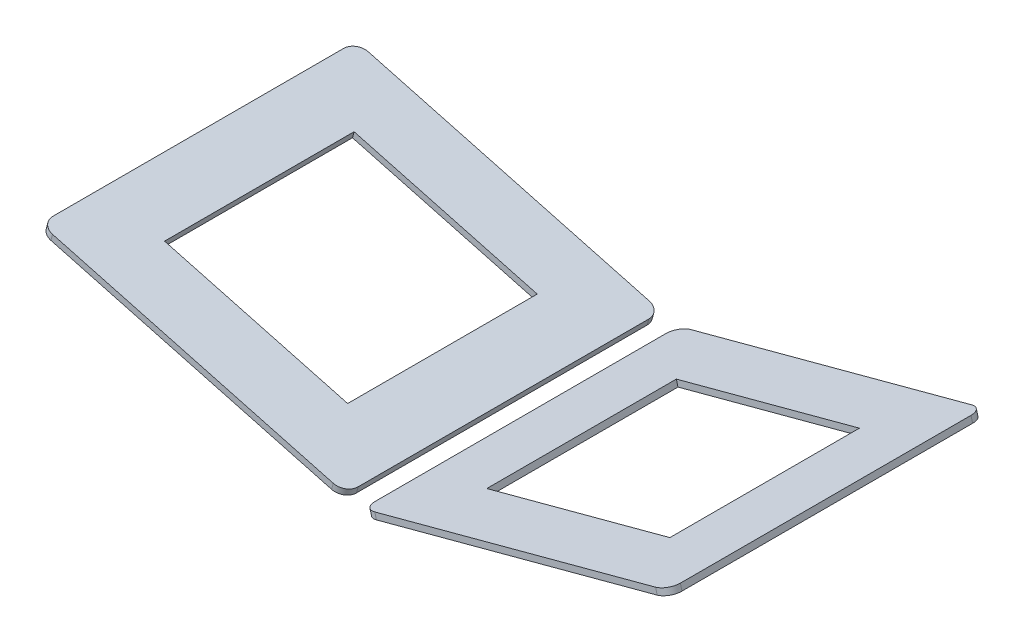
ISO-10303-21;
HEADER;
FILE_DESCRIPTION(('STEP AP214'),'2;1');
FILE_NAME('part.step','',(''),(''),'','','');
FILE_SCHEMA(('AUTOMOTIVE_DESIGN { 1 0 10303 214 1 1 1 1 }'));
ENDSEC;
DATA;
#1=APPLICATION_CONTEXT('core data for automotive mechanical design processes');
#2=APPLICATION_PROTOCOL_DEFINITION('international standard','automotive_design',2000,#1);
#3=PRODUCT_CONTEXT('',#1,'mechanical');
#4=PRODUCT('Part','Part','',(#3));
#5=PRODUCT_RELATED_PRODUCT_CATEGORY('part','',(#4));
#6=PRODUCT_DEFINITION_FORMATION('','',#4);
#7=PRODUCT_DEFINITION_CONTEXT('part definition',#1,'design');
#8=PRODUCT_DEFINITION('design','',#6,#7);
#9=PRODUCT_DEFINITION_SHAPE('','',#8);
#10=(LENGTH_UNIT() NAMED_UNIT(*) SI_UNIT(.MILLI.,.METRE.));
#11=(NAMED_UNIT(*) PLANE_ANGLE_UNIT() SI_UNIT($,.RADIAN.));
#12=(NAMED_UNIT(*) SI_UNIT($,.STERADIAN.) SOLID_ANGLE_UNIT());
#13=UNCERTAINTY_MEASURE_WITH_UNIT(LENGTH_MEASURE(1.E-05),#10,'distance_accuracy_value','');
#14=(GEOMETRIC_REPRESENTATION_CONTEXT(3) GLOBAL_UNCERTAINTY_ASSIGNED_CONTEXT((#13)) GLOBAL_UNIT_ASSIGNED_CONTEXT((#10,
#11,#12)) REPRESENTATION_CONTEXT('',''));
#15=CARTESIAN_POINT('',(0.,0.,0.));
#16=DIRECTION('',(0.,0.,1.));
#17=DIRECTION('',(1.,0.,0.));
#18=AXIS2_PLACEMENT_3D('',#15,#16,#17);
#19=CARTESIAN_POINT('',(48.0374722693509,13.9068780814151,23.3215434083601));
#20=DIRECTION('',(0.258819045102521,-0.965925826289068,0.));
#21=DIRECTION('',(0.,0.,1.));
#22=AXIS2_PLACEMENT_3D('',#19,#20,#21);
#23=PLANE('',#22);
#24=CARTESIAN_POINT('',(48.0374722693509,13.9068780814151,23.3215434083601));
#25=DIRECTION('',(-0.258819045102521,0.965925826289068,0.));
#26=DIRECTION('',(0.,0.,1.));
#27=AXIS2_PLACEMENT_3D('',#24,#25,#26);
#28=CIRCLE('',#27,2.);
#29=CARTESIAN_POINT('',(48.0374722693509,13.9068780814151,25.3215434083601));
#30=VERTEX_POINT('',#29);
#31=CARTESIAN_POINT('',(49.969323921929,14.4245161716202,23.3215434083601));
#32=VERTEX_POINT('',#31);
#33=EDGE_CURVE('E174',#30,#32,#28,.T.);
#34=ORIENTED_EDGE('',*,*,#33,.T.);
#35=DIRECTION('',(0.,0.,-1.));
#36=VECTOR('',#35,1.);
#37=CARTESIAN_POINT('',(49.969323921929,14.4245161716202,23.3215434083601));
#38=LINE('',#37,#36);
#39=CARTESIAN_POINT('',(49.969323921929,14.4245161716202,-22.6784565916399));
#40=VERTEX_POINT('',#39);
#41=EDGE_CURVE('E177',#32,#40,#38,.T.);
#42=ORIENTED_EDGE('',*,*,#41,.T.);
#43=CARTESIAN_POINT('',(48.0374722693509,13.9068780814151,-22.6784565916399));
#44=DIRECTION('',(-0.258819045102521,0.965925826289068,0.));
#45=DIRECTION('',(0.,0.,-1.));
#46=AXIS2_PLACEMENT_3D('',#43,#44,#45);
#47=CIRCLE('',#46,2.);
#48=CARTESIAN_POINT('',(48.0374722693509,13.9068780814151,-24.6784565916399));
#49=VERTEX_POINT('',#48);
#50=EDGE_CURVE('E180',#40,#49,#47,.T.);
#51=ORIENTED_EDGE('',*,*,#50,.T.);
#52=DIRECTION('',(-0.965925826289068,-0.258819045102521,0.));
#53=VECTOR('',#52,1.);
#54=CARTESIAN_POINT('',(48.0374722693509,13.9068780814151,-24.6784565916399));
#55=LINE('',#54,#53);
#56=CARTESIAN_POINT('',(3.60488426005376,2.00120200669916,-24.6784565916399));
#57=VERTEX_POINT('',#56);
#58=EDGE_CURVE('E182',#49,#57,#55,.T.);
#59=ORIENTED_EDGE('',*,*,#58,.T.);
#60=CARTESIAN_POINT('',(3.60488426005375,2.00120200669915,-22.6784565916399));
#61=DIRECTION('',(-0.258819045102521,0.965925826289068,0.));
#62=DIRECTION('',(0.,0.,-1.));
#63=AXIS2_PLACEMENT_3D('',#60,#61,#62);
#64=CIRCLE('',#63,2.);
#65=CARTESIAN_POINT('',(1.67303260747561,1.48356391649411,-22.6784565916399));
#66=VERTEX_POINT('',#65);
#67=EDGE_CURVE('E184',#57,#66,#64,.T.);
#68=ORIENTED_EDGE('',*,*,#67,.T.);
#69=DIRECTION('',(0.,0.,1.));
#70=VECTOR('',#69,1.);
#71=CARTESIAN_POINT('',(1.67303260747562,1.48356391649411,23.3215434083601));
#72=LINE('',#71,#70);
#73=CARTESIAN_POINT('',(1.67303260747562,1.48356391649411,23.3215434083601));
#74=VERTEX_POINT('',#73);
#75=EDGE_CURVE('E186',#66,#74,#72,.T.);
#76=ORIENTED_EDGE('',*,*,#75,.T.);
#77=CARTESIAN_POINT('',(3.60488426005375,2.00120200669915,23.3215434083601));
#78=DIRECTION('',(-0.258819045102521,0.965925826289068,0.));
#79=DIRECTION('',(0.,0.,1.));
#80=AXIS2_PLACEMENT_3D('',#77,#78,#79);
#81=CIRCLE('',#80,2.);
#82=CARTESIAN_POINT('',(3.60488426005377,2.00120200669916,25.3215434083601));
#83=VERTEX_POINT('',#82);
#84=EDGE_CURVE('E188',#74,#83,#81,.T.);
#85=ORIENTED_EDGE('',*,*,#84,.T.);
#86=DIRECTION('',(0.965925826289068,0.258819045102521,0.));
#87=VECTOR('',#86,1.);
#88=CARTESIAN_POINT('',(48.0374722693509,13.9068780814151,25.3215434083601));
#89=LINE('',#88,#87);
#90=EDGE_CURVE('E190',#83,#30,#89,.T.);
#91=ORIENTED_EDGE('',*,*,#90,.T.);
#92=EDGE_LOOP('',(#34,#42,#51,#59,#68,#76,#85,#91));
#93=FACE_BOUND('',#92,.T.);
#94=DIRECTION('',(0.,0.,-1.));
#95=VECTOR('',#94,1.);
#96=CARTESIAN_POINT('',(40.3100656590383,11.836325720595,15.3215434083601));
#97=LINE('',#96,#95);
#98=CARTESIAN_POINT('',(40.3100656590383,11.836325720595,15.3215434083601));
#99=VERTEX_POINT('',#98);
#100=CARTESIAN_POINT('',(40.3100656590383,11.836325720595,-14.6784565916399));
#101=VERTEX_POINT('',#100);
#102=EDGE_CURVE('E138',#99,#101,#97,.T.);
#103=ORIENTED_EDGE('',*,*,#102,.F.);
#104=DIRECTION('',(0.965925826289068,0.258819045102521,0.));
#105=VECTOR('',#104,1.);
#106=CARTESIAN_POINT('',(40.3100656590383,11.836325720595,15.3215434083601));
#107=LINE('',#106,#105);
#108=CARTESIAN_POINT('',(11.3322908703663,4.07175436751933,15.3215434083601));
#109=VERTEX_POINT('',#108);
#110=EDGE_CURVE('E160',#109,#99,#107,.T.);
#111=ORIENTED_EDGE('',*,*,#110,.F.);
#112=DIRECTION('',(0.,0.,1.));
#113=VECTOR('',#112,1.);
#114=CARTESIAN_POINT('',(11.3322908703663,4.07175436751933,15.3215434083601));
#115=LINE('',#114,#113);
#116=CARTESIAN_POINT('',(11.3322908703663,4.07175436751933,-14.6784565916399));
#117=VERTEX_POINT('',#116);
#118=EDGE_CURVE('E158',#117,#109,#115,.T.);
#119=ORIENTED_EDGE('',*,*,#118,.F.);
#120=DIRECTION('',(-0.965925826289068,-0.258819045102521,0.));
#121=VECTOR('',#120,1.);
#122=CARTESIAN_POINT('',(40.3100656590383,11.836325720595,-14.6784565916399));
#123=LINE('',#122,#121);
#124=EDGE_CURVE('E146',#101,#117,#123,.T.);
#125=ORIENTED_EDGE('',*,*,#124,.F.);
#126=EDGE_LOOP('',(#103,#111,#119,#125));
#127=FACE_BOUND('',#126,.T.);
#128=ADVANCED_FACE('F49',(#93,#127),#23,.F.);
#129=CARTESIAN_POINT('',(48.2962913144534,12.9409522551261,23.3215434083601));
#130=DIRECTION('',(0.258819045102521,-0.965925826289068,0.));
#131=DIRECTION('',(0.,0.,1.));
#132=AXIS2_PLACEMENT_3D('',#129,#130,#131);
#133=PLANE('',#132);
#134=CARTESIAN_POINT('',(48.2962913144534,12.9409522551261,23.3215434083601));
#135=DIRECTION('',(-0.258819045102521,0.965925826289068,0.));
#136=DIRECTION('',(0.,0.,1.));
#137=AXIS2_PLACEMENT_3D('',#134,#135,#136);
#138=CIRCLE('',#137,2.);
#139=CARTESIAN_POINT('',(48.2962913144534,12.9409522551261,25.3215434083601));
#140=VERTEX_POINT('',#139);
#141=CARTESIAN_POINT('',(50.2281429670316,13.4585903453311,23.3215434083601));
#142=VERTEX_POINT('',#141);
#143=EDGE_CURVE('E154',#140,#142,#138,.T.);
#144=ORIENTED_EDGE('',*,*,#143,.F.);
#145=DIRECTION('',(0.965925826289068,0.258819045102521,0.));
#146=VECTOR('',#145,1.);
#147=CARTESIAN_POINT('',(48.2962913144534,12.9409522551261,25.3215434083601));
#148=LINE('',#147,#146);
#149=CARTESIAN_POINT('',(3.86370330515629,1.03527618041009,25.3215434083601));
#150=VERTEX_POINT('',#149);
#151=EDGE_CURVE('E178',#150,#140,#148,.T.);
#152=ORIENTED_EDGE('',*,*,#151,.F.);
#153=CARTESIAN_POINT('',(3.86370330515628,1.03527618041009,23.3215434083601));
#154=DIRECTION('',(-0.258819045102521,0.965925826289068,0.));
#155=DIRECTION('',(0.,0.,1.));
#156=AXIS2_PLACEMENT_3D('',#153,#154,#155);
#157=CIRCLE('',#156,2.);
#158=CARTESIAN_POINT('',(1.93185165257814,0.517638090205043,23.3215434083601));
#159=VERTEX_POINT('',#158);
#160=EDGE_CURVE('E205',#159,#150,#157,.T.);
#161=ORIENTED_EDGE('',*,*,#160,.F.);
#162=DIRECTION('',(0.,0.,1.));
#163=VECTOR('',#162,1.);
#164=CARTESIAN_POINT('',(1.93185165257814,0.517638090205043,23.3215434083601));
#165=LINE('',#164,#163);
#166=CARTESIAN_POINT('',(1.93185165257813,0.517638090205041,-22.6784565916399));
#167=VERTEX_POINT('',#166);
#168=EDGE_CURVE('E203',#167,#159,#165,.T.);
#169=ORIENTED_EDGE('',*,*,#168,.F.);
#170=CARTESIAN_POINT('',(3.86370330515627,1.03527618041008,-22.6784565916399));
#171=DIRECTION('',(-0.258819045102521,0.965925826289068,0.));
#172=DIRECTION('',(0.,0.,-1.));
#173=AXIS2_PLACEMENT_3D('',#170,#171,#172);
#174=CIRCLE('',#173,2.);
#175=CARTESIAN_POINT('',(3.86370330515628,1.03527618041009,-24.6784565916399));
#176=VERTEX_POINT('',#175);
#177=EDGE_CURVE('E201',#176,#167,#174,.T.);
#178=ORIENTED_EDGE('',*,*,#177,.F.);
#179=DIRECTION('',(-0.965925826289068,-0.258819045102521,0.));
#180=VECTOR('',#179,1.);
#181=CARTESIAN_POINT('',(48.2962913144534,12.9409522551261,-24.6784565916399));
#182=LINE('',#181,#180);
#183=CARTESIAN_POINT('',(48.2962913144534,12.9409522551261,-24.6784565916399));
#184=VERTEX_POINT('',#183);
#185=EDGE_CURVE('E199',#184,#176,#182,.T.);
#186=ORIENTED_EDGE('',*,*,#185,.F.);
#187=CARTESIAN_POINT('',(48.2962913144534,12.9409522551261,-22.6784565916399));
#188=DIRECTION('',(-0.258819045102521,0.965925826289068,0.));
#189=DIRECTION('',(0.,0.,-1.));
#190=AXIS2_PLACEMENT_3D('',#187,#188,#189);
#191=CIRCLE('',#190,2.);
#192=CARTESIAN_POINT('',(50.2281429670315,13.4585903453311,-22.6784565916399));
#193=VERTEX_POINT('',#192);
#194=EDGE_CURVE('E197',#193,#184,#191,.T.);
#195=ORIENTED_EDGE('',*,*,#194,.F.);
#196=DIRECTION('',(0.,0.,-1.));
#197=VECTOR('',#196,1.);
#198=CARTESIAN_POINT('',(50.2281429670316,13.4585903453311,23.3215434083601));
#199=LINE('',#198,#197);
#200=EDGE_CURVE('E195',#142,#193,#199,.T.);
#201=ORIENTED_EDGE('',*,*,#200,.F.);
#202=EDGE_LOOP('',(#144,#152,#161,#169,#178,#186,#195,#201));
#203=FACE_BOUND('',#202,.T.);
#204=DIRECTION('',(0.965925826289068,0.258819045102521,0.));
#205=VECTOR('',#204,1.);
#206=CARTESIAN_POINT('',(40.5688847041409,10.8703998943059,15.3215434083601));
#207=LINE('',#206,#205);
#208=CARTESIAN_POINT('',(11.5911099154688,3.10582854123026,15.3215434083601));
#209=VERTEX_POINT('',#208);
#210=CARTESIAN_POINT('',(40.5688847041409,10.8703998943059,15.3215434083601));
#211=VERTEX_POINT('',#210);
#212=EDGE_CURVE('E147',#209,#211,#207,.T.);
#213=ORIENTED_EDGE('',*,*,#212,.T.);
#214=DIRECTION('',(0.,0.,-1.));
#215=VECTOR('',#214,1.);
#216=CARTESIAN_POINT('',(40.5688847041409,10.8703998943059,15.3215434083601));
#217=LINE('',#216,#215);
#218=CARTESIAN_POINT('',(40.5688847041409,10.8703998943059,-14.6784565916399));
#219=VERTEX_POINT('',#218);
#220=EDGE_CURVE('E72',#211,#219,#217,.T.);
#221=ORIENTED_EDGE('',*,*,#220,.T.);
#222=DIRECTION('',(-0.965925826289068,-0.258819045102521,0.));
#223=VECTOR('',#222,1.);
#224=CARTESIAN_POINT('',(40.5688847041409,10.8703998943059,-14.6784565916399));
#225=LINE('',#224,#223);
#226=CARTESIAN_POINT('',(11.5911099154688,3.10582854123026,-14.6784565916399));
#227=VERTEX_POINT('',#226);
#228=EDGE_CURVE('E153',#219,#227,#225,.T.);
#229=ORIENTED_EDGE('',*,*,#228,.T.);
#230=DIRECTION('',(0.,0.,1.));
#231=VECTOR('',#230,1.);
#232=CARTESIAN_POINT('',(11.5911099154688,3.10582854123026,15.3215434083601));
#233=LINE('',#232,#231);
#234=EDGE_CURVE('E166',#227,#209,#233,.T.);
#235=ORIENTED_EDGE('',*,*,#234,.T.);
#236=EDGE_LOOP('',(#213,#221,#229,#235));
#237=FACE_BOUND('',#236,.T.);
#238=ADVANCED_FACE('F235',(#203,#237),#133,.T.);
#239=CARTESIAN_POINT('',(48.0374722693509,13.9068780814151,23.3215434083601));
#240=DIRECTION('',(0.258819045102521,-0.965925826289068,0.));
#241=DIRECTION('',(0.,0.,1.));
#242=AXIS2_PLACEMENT_3D('',#239,#240,#241);
#243=CYLINDRICAL_SURFACE('',#242,2.);
#244=ORIENTED_EDGE('',*,*,#143,.T.);
#245=DIRECTION('',(0.258819045102521,-0.965925826289068,0.));
#246=VECTOR('',#245,1.);
#247=CARTESIAN_POINT('',(49.969323921929,14.4245161716202,23.3215434083601));
#248=LINE('',#247,#246);
#249=EDGE_CURVE('E12',#32,#142,#248,.T.);
#250=ORIENTED_EDGE('',*,*,#249,.F.);
#251=ORIENTED_EDGE('',*,*,#33,.F.);
#252=DIRECTION('',(0.258819045102521,-0.965925826289068,0.));
#253=VECTOR('',#252,1.);
#254=CARTESIAN_POINT('',(48.0374722693509,13.9068780814151,25.3215434083601));
#255=LINE('',#254,#253);
#256=EDGE_CURVE('E192',#30,#140,#255,.T.);
#257=ORIENTED_EDGE('',*,*,#256,.T.);
#258=EDGE_LOOP('',(#244,#250,#251,#257));
#259=FACE_BOUND('',#258,.T.);
#260=ADVANCED_FACE('F51',(#259),#243,.T.);
#261=CARTESIAN_POINT('',(49.969323921929,14.4245161716202,23.3215434083601));
#262=DIRECTION('',(-0.965925826289068,-0.258819045102521,0.));
#263=DIRECTION('',(0.,0.,1.));
#264=AXIS2_PLACEMENT_3D('',#261,#262,#263);
#265=PLANE('',#264);
#266=ORIENTED_EDGE('',*,*,#200,.T.);
#267=DIRECTION('',(0.258819045102521,-0.965925826289068,0.));
#268=VECTOR('',#267,1.);
#269=CARTESIAN_POINT('',(49.969323921929,14.4245161716202,-22.6784565916399));
#270=LINE('',#269,#268);
#271=EDGE_CURVE('E57',#40,#193,#270,.T.);
#272=ORIENTED_EDGE('',*,*,#271,.F.);
#273=ORIENTED_EDGE('',*,*,#41,.F.);
#274=ORIENTED_EDGE('',*,*,#249,.T.);
#275=EDGE_LOOP('',(#266,#272,#273,#274));
#276=FACE_BOUND('',#275,.T.);
#277=ADVANCED_FACE('F252',(#276),#265,.F.);
#278=CARTESIAN_POINT('',(48.0374722693509,13.9068780814151,-22.6784565916399));
#279=DIRECTION('',(0.258819045102521,-0.965925826289068,0.));
#280=DIRECTION('',(0.,0.,1.));
#281=AXIS2_PLACEMENT_3D('',#278,#279,#280);
#282=CYLINDRICAL_SURFACE('',#281,2.);
#283=ORIENTED_EDGE('',*,*,#194,.T.);
#284=DIRECTION('',(0.258819045102521,-0.965925826289068,0.));
#285=VECTOR('',#284,1.);
#286=CARTESIAN_POINT('',(48.0374722693509,13.9068780814151,-24.6784565916399));
#287=LINE('',#286,#285);
#288=EDGE_CURVE('E222',#49,#184,#287,.T.);
#289=ORIENTED_EDGE('',*,*,#288,.F.);
#290=ORIENTED_EDGE('',*,*,#50,.F.);
#291=ORIENTED_EDGE('',*,*,#271,.T.);
#292=EDGE_LOOP('',(#283,#289,#290,#291));
#293=FACE_BOUND('',#292,.T.);
#294=ADVANCED_FACE('F229',(#293),#282,.T.);
#295=CARTESIAN_POINT('',(48.0374722693509,13.9068780814151,-24.6784565916399));
#296=DIRECTION('',(0.,0.,1.));
#297=DIRECTION('',(0.965925826289068,0.258819045102521,0.));
#298=AXIS2_PLACEMENT_3D('',#295,#296,#297);
#299=PLANE('',#298);
#300=ORIENTED_EDGE('',*,*,#185,.T.);
#301=DIRECTION('',(0.258819045102521,-0.965925826289068,0.));
#302=VECTOR('',#301,1.);
#303=CARTESIAN_POINT('',(3.60488426005376,2.00120200669916,-24.6784565916399));
#304=LINE('',#303,#302);
#305=EDGE_CURVE('E219',#57,#176,#304,.T.);
#306=ORIENTED_EDGE('',*,*,#305,.F.);
#307=ORIENTED_EDGE('',*,*,#58,.F.);
#308=ORIENTED_EDGE('',*,*,#288,.T.);
#309=EDGE_LOOP('',(#300,#306,#307,#308));
#310=FACE_BOUND('',#309,.T.);
#311=ADVANCED_FACE('F241',(#310),#299,.F.);
#312=CARTESIAN_POINT('',(3.60488426005375,2.00120200669915,-22.6784565916399));
#313=DIRECTION('',(0.258819045102521,-0.965925826289068,0.));
#314=DIRECTION('',(0.,0.,1.));
#315=AXIS2_PLACEMENT_3D('',#312,#313,#314);
#316=CYLINDRICAL_SURFACE('',#315,2.);
#317=ORIENTED_EDGE('',*,*,#177,.T.);
#318=DIRECTION('',(0.258819045102521,-0.965925826289068,0.));
#319=VECTOR('',#318,1.);
#320=CARTESIAN_POINT('',(1.67303260747561,1.48356391649411,-22.6784565916399));
#321=LINE('',#320,#319);
#322=EDGE_CURVE('E216',#66,#167,#321,.T.);
#323=ORIENTED_EDGE('',*,*,#322,.F.);
#324=ORIENTED_EDGE('',*,*,#67,.F.);
#325=ORIENTED_EDGE('',*,*,#305,.T.);
#326=EDGE_LOOP('',(#317,#323,#324,#325));
#327=FACE_BOUND('',#326,.T.);
#328=ADVANCED_FACE('F245',(#327),#316,.T.);
#329=CARTESIAN_POINT('',(1.67303260747562,1.48356391649411,23.3215434083601));
#330=DIRECTION('',(0.965925826289068,0.258819045102521,0.));
#331=DIRECTION('',(0.,0.,-1.));
#332=AXIS2_PLACEMENT_3D('',#329,#330,#331);
#333=PLANE('',#332);
#334=ORIENTED_EDGE('',*,*,#168,.T.);
#335=DIRECTION('',(0.258819045102521,-0.965925826289068,0.));
#336=VECTOR('',#335,1.);
#337=CARTESIAN_POINT('',(1.67303260747562,1.48356391649411,23.3215434083601));
#338=LINE('',#337,#336);
#339=EDGE_CURVE('E213',#74,#159,#338,.T.);
#340=ORIENTED_EDGE('',*,*,#339,.F.);
#341=ORIENTED_EDGE('',*,*,#75,.F.);
#342=ORIENTED_EDGE('',*,*,#322,.T.);
#343=EDGE_LOOP('',(#334,#340,#341,#342));
#344=FACE_BOUND('',#343,.T.);
#345=ADVANCED_FACE('F265',(#344),#333,.F.);
#346=CARTESIAN_POINT('',(3.60488426005375,2.00120200669915,23.3215434083601));
#347=DIRECTION('',(0.258819045102521,-0.965925826289068,0.));
#348=DIRECTION('',(0.,0.,1.));
#349=AXIS2_PLACEMENT_3D('',#346,#347,#348);
#350=CYLINDRICAL_SURFACE('',#349,2.);
#351=ORIENTED_EDGE('',*,*,#160,.T.);
#352=DIRECTION('',(0.258819045102521,-0.965925826289068,0.));
#353=VECTOR('',#352,1.);
#354=CARTESIAN_POINT('',(3.60488426005377,2.00120200669916,25.3215434083601));
#355=LINE('',#354,#353);
#356=EDGE_CURVE('E210',#83,#150,#355,.T.);
#357=ORIENTED_EDGE('',*,*,#356,.F.);
#358=ORIENTED_EDGE('',*,*,#84,.F.);
#359=ORIENTED_EDGE('',*,*,#339,.T.);
#360=EDGE_LOOP('',(#351,#357,#358,#359));
#361=FACE_BOUND('',#360,.T.);
#362=ADVANCED_FACE('F263',(#361),#350,.T.);
#363=CARTESIAN_POINT('',(48.0374722693509,13.9068780814151,25.3215434083601));
#364=DIRECTION('',(0.,0.,-1.));
#365=DIRECTION('',(-0.965925826289068,-0.258819045102521,0.));
#366=AXIS2_PLACEMENT_3D('',#363,#364,#365);
#367=PLANE('',#366);
#368=ORIENTED_EDGE('',*,*,#151,.T.);
#369=ORIENTED_EDGE('',*,*,#256,.F.);
#370=ORIENTED_EDGE('',*,*,#90,.F.);
#371=ORIENTED_EDGE('',*,*,#356,.T.);
#372=EDGE_LOOP('',(#368,#369,#370,#371));
#373=FACE_BOUND('',#372,.T.);
#374=ADVANCED_FACE('F258',(#373),#367,.F.);
#375=CARTESIAN_POINT('',(40.3100656590383,11.836325720595,15.3215434083601));
#376=DIRECTION('',(-0.965925826289068,-0.258819045102521,0.));
#377=DIRECTION('',(0.,0.,1.));
#378=AXIS2_PLACEMENT_3D('',#375,#376,#377);
#379=PLANE('',#378);
#380=ORIENTED_EDGE('',*,*,#220,.F.);
#381=DIRECTION('',(0.258819045102521,-0.965925826289068,0.));
#382=VECTOR('',#381,1.);
#383=CARTESIAN_POINT('',(40.3100656590383,11.836325720595,15.3215434083601));
#384=LINE('',#383,#382);
#385=EDGE_CURVE('E142',#99,#211,#384,.T.);
#386=ORIENTED_EDGE('',*,*,#385,.F.);
#387=ORIENTED_EDGE('',*,*,#102,.T.);
#388=DIRECTION('',(0.258819045102521,-0.965925826289068,0.));
#389=VECTOR('',#388,1.);
#390=CARTESIAN_POINT('',(40.3100656590383,11.836325720595,-14.6784565916399));
#391=LINE('',#390,#389);
#392=EDGE_CURVE('E141',#101,#219,#391,.T.);
#393=ORIENTED_EDGE('',*,*,#392,.T.);
#394=EDGE_LOOP('',(#380,#386,#387,#393));
#395=FACE_BOUND('',#394,.T.);
#396=ADVANCED_FACE('F140',(#395),#379,.T.);
#397=CARTESIAN_POINT('',(40.3100656590383,11.836325720595,-14.6784565916399));
#398=DIRECTION('',(0.,0.,1.));
#399=DIRECTION('',(0.965925826289068,0.258819045102521,0.));
#400=AXIS2_PLACEMENT_3D('',#397,#398,#399);
#401=PLANE('',#400);
#402=ORIENTED_EDGE('',*,*,#228,.F.);
#403=ORIENTED_EDGE('',*,*,#392,.F.);
#404=ORIENTED_EDGE('',*,*,#124,.T.);
#405=DIRECTION('',(0.258819045102521,-0.965925826289068,0.));
#406=VECTOR('',#405,1.);
#407=CARTESIAN_POINT('',(11.3322908703663,4.07175436751933,-14.6784565916399));
#408=LINE('',#407,#406);
#409=EDGE_CURVE('E155',#117,#227,#408,.T.);
#410=ORIENTED_EDGE('',*,*,#409,.T.);
#411=EDGE_LOOP('',(#402,#403,#404,#410));
#412=FACE_BOUND('',#411,.T.);
#413=ADVANCED_FACE('F150',(#412),#401,.T.);
#414=CARTESIAN_POINT('',(11.3322908703663,4.07175436751933,15.3215434083601));
#415=DIRECTION('',(0.965925826289068,0.258819045102521,0.));
#416=DIRECTION('',(0.,0.,-1.));
#417=AXIS2_PLACEMENT_3D('',#414,#415,#416);
#418=PLANE('',#417);
#419=ORIENTED_EDGE('',*,*,#234,.F.);
#420=ORIENTED_EDGE('',*,*,#409,.F.);
#421=ORIENTED_EDGE('',*,*,#118,.T.);
#422=DIRECTION('',(0.258819045102521,-0.965925826289068,0.));
#423=VECTOR('',#422,1.);
#424=CARTESIAN_POINT('',(11.3322908703663,4.07175436751933,15.3215434083601));
#425=LINE('',#424,#423);
#426=EDGE_CURVE('E64',#109,#209,#425,.T.);
#427=ORIENTED_EDGE('',*,*,#426,.T.);
#428=EDGE_LOOP('',(#419,#420,#421,#427));
#429=FACE_BOUND('',#428,.T.);
#430=ADVANCED_FACE('F290',(#429),#418,.T.);
#431=CARTESIAN_POINT('',(40.3100656590383,11.836325720595,15.3215434083601));
#432=DIRECTION('',(0.,0.,-1.));
#433=DIRECTION('',(-0.965925826289068,-0.258819045102521,0.));
#434=AXIS2_PLACEMENT_3D('',#431,#432,#433);
#435=PLANE('',#434);
#436=ORIENTED_EDGE('',*,*,#212,.F.);
#437=ORIENTED_EDGE('',*,*,#426,.F.);
#438=ORIENTED_EDGE('',*,*,#110,.T.);
#439=ORIENTED_EDGE('',*,*,#385,.T.);
#440=EDGE_LOOP('',(#436,#437,#438,#439));
#441=FACE_BOUND('',#440,.T.);
#442=ADVANCED_FACE('F294',(#441),#435,.T.);
#443=CLOSED_SHELL('',(#128,#238,#260,#277,#294,#311,#328,#345,#362,#374,#396,#413,#430,#442));
#444=MANIFOLD_SOLID_BREP('B2',#443);
#445=CARTESIAN_POINT('',(0.,0.,0.));
#446=DIRECTION('',(0.,0.,1.));
#447=DIRECTION('',(1.,0.,0.));
#448=AXIS2_PLACEMENT_3D('',#445,#446,#447);
#449=PLANE('',#448);
#450=DIRECTION('',(0.25881904510252,-0.965925826289069,0.));
#451=VECTOR('',#450,1.);
#452=CARTESIAN_POINT('',(50.2281429670315,13.4585903453311,0.));
#453=LINE('',#452,#451);
#454=CARTESIAN_POINT('',(49.969323921929,14.4245161716202,0.));
#455=VERTEX_POINT('',#454);
#456=CARTESIAN_POINT('',(50.2281429670315,13.4585903453311,0.));
#457=VERTEX_POINT('',#456);
#458=EDGE_CURVE('E402',#455,#457,#453,.T.);
#459=ORIENTED_EDGE('',*,*,#458,.T.);
#460=DIRECTION('',(-0.965925826289068,-0.258819045102521,0.));
#461=VECTOR('',#460,1.);
#462=CARTESIAN_POINT('',(40.5688847041409,10.8703998943059,0.));
#463=LINE('',#462,#461);
#464=CARTESIAN_POINT('',(40.5688847041409,10.8703998943059,0.));
#465=VERTEX_POINT('',#464);
#466=EDGE_CURVE('E413',#457,#465,#463,.T.);
#467=ORIENTED_EDGE('',*,*,#466,.T.);
#468=DIRECTION('',(-0.25881904510252,0.965925826289069,0.));
#469=VECTOR('',#468,1.);
#470=CARTESIAN_POINT('',(40.3100656590383,11.836325720595,0.));
#471=LINE('',#470,#469);
#472=CARTESIAN_POINT('',(40.3100656590383,11.836325720595,0.));
#473=VERTEX_POINT('',#472);
#474=EDGE_CURVE('E398',#465,#473,#471,.T.);
#475=ORIENTED_EDGE('',*,*,#474,.T.);
#476=DIRECTION('',(0.965925826289068,0.258819045102521,0.));
#477=VECTOR('',#476,1.);
#478=CARTESIAN_POINT('',(49.969323921929,14.4245161716202,0.));
#479=LINE('',#478,#477);
#480=EDGE_CURVE('E47',#473,#455,#479,.T.);
#481=ORIENTED_EDGE('',*,*,#480,.T.);
#482=EDGE_LOOP('',(#459,#467,#475,#481));
#483=FACE_BOUND('',#482,.T.);
#484=ADVANCED_FACE('F393',(#483),#449,.F.);
#485=OPEN_SHELL('',(#484));
#486=SHELL_BASED_SURFACE_MODEL('B6',(#485));
#487=CARTESIAN_POINT('',(0.,0.,0.));
#488=DIRECTION('',(0.,0.,-1.));
#489=DIRECTION('',(-1.,0.,0.));
#490=AXIS2_PLACEMENT_3D('',#487,#488,#489);
#491=PLANE('',#490);
#492=DIRECTION('',(-0.25881904510252,-0.965925826289069,0.));
#493=VECTOR('',#492,1.);
#494=CARTESIAN_POINT('',(-50.2281429670315,13.4585903453311,0.));
#495=LINE('',#494,#493);
#496=CARTESIAN_POINT('',(-49.969323921929,14.4245161716202,0.));
#497=VERTEX_POINT('',#496);
#498=CARTESIAN_POINT('',(-50.2281429670315,13.4585903453311,0.));
#499=VERTEX_POINT('',#498);
#500=EDGE_CURVE('E456',#497,#499,#495,.T.);
#501=ORIENTED_EDGE('',*,*,#500,.T.);
#502=DIRECTION('',(0.965925826289068,-0.258819045102521,0.));
#503=VECTOR('',#502,1.);
#504=CARTESIAN_POINT('',(-40.5688847041409,10.8703998943059,0.));
#505=LINE('',#504,#503);
#506=CARTESIAN_POINT('',(-40.5688847041409,10.8703998943059,0.));
#507=VERTEX_POINT('',#506);
#508=EDGE_CURVE('E467',#499,#507,#505,.T.);
#509=ORIENTED_EDGE('',*,*,#508,.T.);
#510=DIRECTION('',(0.25881904510252,0.965925826289069,0.));
#511=VECTOR('',#510,1.);
#512=CARTESIAN_POINT('',(-40.3100656590383,11.836325720595,0.));
#513=LINE('',#512,#511);
#514=CARTESIAN_POINT('',(-40.3100656590383,11.836325720595,0.));
#515=VERTEX_POINT('',#514);
#516=EDGE_CURVE('E452',#507,#515,#513,.T.);
#517=ORIENTED_EDGE('',*,*,#516,.T.);
#518=DIRECTION('',(-0.965925826289068,0.258819045102521,0.));
#519=VECTOR('',#518,1.);
#520=CARTESIAN_POINT('',(-49.969323921929,14.4245161716202,0.));
#521=LINE('',#520,#519);
#522=EDGE_CURVE('E391',#515,#497,#521,.T.);
#523=ORIENTED_EDGE('',*,*,#522,.T.);
#524=EDGE_LOOP('',(#501,#509,#517,#523));
#525=FACE_BOUND('',#524,.T.);
#526=ADVANCED_FACE('F447',(#525),#491,.F.);
#527=OPEN_SHELL('',(#526));
#528=SHELL_BASED_SURFACE_MODEL('B41',(#527));
#529=CARTESIAN_POINT('',(-48.0374722693509,13.9068780814151,-23.3215434083601));
#530=DIRECTION('',(-0.258819045102521,-0.965925826289068,0.));
#531=DIRECTION('',(0.,0.,-1.));
#532=AXIS2_PLACEMENT_3D('',#529,#530,#531);
#533=PLANE('',#532);
#534=CARTESIAN_POINT('',(-48.0374722693509,13.9068780814151,-23.3215434083601));
#535=DIRECTION('',(0.258819045102521,0.965925826289068,0.));
#536=DIRECTION('',(0.,0.,-1.));
#537=AXIS2_PLACEMENT_3D('',#534,#535,#536);
#538=CIRCLE('',#537,2.);
#539=CARTESIAN_POINT('',(-48.0374722693509,13.9068780814151,-25.3215434083601));
#540=VERTEX_POINT('',#539);
#541=CARTESIAN_POINT('',(-49.969323921929,14.4245161716202,-23.3215434083601));
#542=VERTEX_POINT('',#541);
#543=EDGE_CURVE('E615',#540,#542,#538,.T.);
#544=ORIENTED_EDGE('',*,*,#543,.T.);
#545=DIRECTION('',(0.,0.,1.));
#546=VECTOR('',#545,1.);
#547=CARTESIAN_POINT('',(-49.969323921929,14.4245161716202,-23.3215434083601));
#548=LINE('',#547,#546);
#549=CARTESIAN_POINT('',(-49.969323921929,14.4245161716202,22.6784565916399));
#550=VERTEX_POINT('',#549);
#551=EDGE_CURVE('E618',#542,#550,#548,.T.);
#552=ORIENTED_EDGE('',*,*,#551,.T.);
#553=CARTESIAN_POINT('',(-48.0374722693509,13.9068780814151,22.6784565916399));
#554=DIRECTION('',(0.258819045102521,0.965925826289068,0.));
#555=DIRECTION('',(0.,0.,1.));
#556=AXIS2_PLACEMENT_3D('',#553,#554,#555);
#557=CIRCLE('',#556,2.);
#558=CARTESIAN_POINT('',(-48.0374722693509,13.9068780814151,24.6784565916399));
#559=VERTEX_POINT('',#558);
#560=EDGE_CURVE('E621',#550,#559,#557,.T.);
#561=ORIENTED_EDGE('',*,*,#560,.T.);
#562=DIRECTION('',(0.965925826289068,-0.258819045102521,0.));
#563=VECTOR('',#562,1.);
#564=CARTESIAN_POINT('',(-48.0374722693509,13.9068780814151,24.6784565916399));
#565=LINE('',#564,#563);
#566=CARTESIAN_POINT('',(-3.60488426005376,2.00120200669916,24.6784565916399));
#567=VERTEX_POINT('',#566);
#568=EDGE_CURVE('E623',#559,#567,#565,.T.);
#569=ORIENTED_EDGE('',*,*,#568,.T.);
#570=CARTESIAN_POINT('',(-3.60488426005375,2.00120200669915,22.6784565916399));
#571=DIRECTION('',(0.258819045102521,0.965925826289068,0.));
#572=DIRECTION('',(0.,0.,1.));
#573=AXIS2_PLACEMENT_3D('',#570,#571,#572);
#574=CIRCLE('',#573,2.);
#575=CARTESIAN_POINT('',(-1.67303260747561,1.48356391649411,22.6784565916399));
#576=VERTEX_POINT('',#575);
#577=EDGE_CURVE('E625',#567,#576,#574,.T.);
#578=ORIENTED_EDGE('',*,*,#577,.T.);
#579=DIRECTION('',(0.,0.,-1.));
#580=VECTOR('',#579,1.);
#581=CARTESIAN_POINT('',(-1.67303260747562,1.48356391649411,-23.3215434083601));
#582=LINE('',#581,#580);
#583=CARTESIAN_POINT('',(-1.67303260747562,1.48356391649411,-23.3215434083601));
#584=VERTEX_POINT('',#583);
#585=EDGE_CURVE('E627',#576,#584,#582,.T.);
#586=ORIENTED_EDGE('',*,*,#585,.T.);
#587=CARTESIAN_POINT('',(-3.60488426005375,2.00120200669915,-23.3215434083601));
#588=DIRECTION('',(0.258819045102521,0.965925826289068,0.));
#589=DIRECTION('',(0.,0.,-1.));
#590=AXIS2_PLACEMENT_3D('',#587,#588,#589);
#591=CIRCLE('',#590,2.);
#592=CARTESIAN_POINT('',(-3.60488426005377,2.00120200669916,-25.3215434083601));
#593=VERTEX_POINT('',#592);
#594=EDGE_CURVE('E629',#584,#593,#591,.T.);
#595=ORIENTED_EDGE('',*,*,#594,.T.);
#596=DIRECTION('',(-0.965925826289068,0.258819045102521,0.));
#597=VECTOR('',#596,1.);
#598=CARTESIAN_POINT('',(-48.0374722693509,13.9068780814151,-25.3215434083601));
#599=LINE('',#598,#597);
#600=EDGE_CURVE('E631',#593,#540,#599,.T.);
#601=ORIENTED_EDGE('',*,*,#600,.T.);
#602=EDGE_LOOP('',(#544,#552,#561,#569,#578,#586,#595,#601));
#603=FACE_BOUND('',#602,.T.);
#604=DIRECTION('',(0.,0.,1.));
#605=VECTOR('',#604,1.);
#606=CARTESIAN_POINT('',(-40.3100656590383,11.836325720595,-15.3215434083601));
#607=LINE('',#606,#605);
#608=CARTESIAN_POINT('',(-40.3100656590383,11.836325720595,-15.3215434083601));
#609=VERTEX_POINT('',#608);
#610=CARTESIAN_POINT('',(-40.3100656590383,11.836325720595,14.6784565916399));
#611=VERTEX_POINT('',#610);
#612=EDGE_CURVE('E579',#609,#611,#607,.T.);
#613=ORIENTED_EDGE('',*,*,#612,.F.);
#614=DIRECTION('',(-0.965925826289068,0.258819045102521,0.));
#615=VECTOR('',#614,1.);
#616=CARTESIAN_POINT('',(-40.3100656590383,11.836325720595,-15.3215434083601));
#617=LINE('',#616,#615);
#618=CARTESIAN_POINT('',(-11.3322908703663,4.07175436751933,-15.3215434083601));
#619=VERTEX_POINT('',#618);
#620=EDGE_CURVE('E601',#619,#609,#617,.T.);
#621=ORIENTED_EDGE('',*,*,#620,.F.);
#622=DIRECTION('',(0.,0.,-1.));
#623=VECTOR('',#622,1.);
#624=CARTESIAN_POINT('',(-11.3322908703663,4.07175436751933,-15.3215434083601));
#625=LINE('',#624,#623);
#626=CARTESIAN_POINT('',(-11.3322908703663,4.07175436751933,14.6784565916399));
#627=VERTEX_POINT('',#626);
#628=EDGE_CURVE('E599',#627,#619,#625,.T.);
#629=ORIENTED_EDGE('',*,*,#628,.F.);
#630=DIRECTION('',(0.965925826289068,-0.258819045102521,0.));
#631=VECTOR('',#630,1.);
#632=CARTESIAN_POINT('',(-40.3100656590383,11.836325720595,14.6784565916399));
#633=LINE('',#632,#631);
#634=EDGE_CURVE('E587',#611,#627,#633,.T.);
#635=ORIENTED_EDGE('',*,*,#634,.F.);
#636=EDGE_LOOP('',(#613,#621,#629,#635));
#637=FACE_BOUND('',#636,.T.);
#638=ADVANCED_FACE('F490',(#603,#637),#533,.F.);
#639=CARTESIAN_POINT('',(-48.2962913144534,12.9409522551261,-23.3215434083601));
#640=DIRECTION('',(-0.258819045102521,-0.965925826289068,0.));
#641=DIRECTION('',(0.,0.,-1.));
#642=AXIS2_PLACEMENT_3D('',#639,#640,#641);
#643=PLANE('',#642);
#644=CARTESIAN_POINT('',(-48.2962913144534,12.9409522551261,-23.3215434083601));
#645=DIRECTION('',(0.258819045102521,0.965925826289068,0.));
#646=DIRECTION('',(0.,0.,-1.));
#647=AXIS2_PLACEMENT_3D('',#644,#645,#646);
#648=CIRCLE('',#647,2.);
#649=CARTESIAN_POINT('',(-48.2962913144534,12.9409522551261,-25.3215434083601));
#650=VERTEX_POINT('',#649);
#651=CARTESIAN_POINT('',(-50.2281429670316,13.4585903453311,-23.3215434083601));
#652=VERTEX_POINT('',#651);
#653=EDGE_CURVE('E595',#650,#652,#648,.T.);
#654=ORIENTED_EDGE('',*,*,#653,.F.);
#655=DIRECTION('',(-0.965925826289068,0.258819045102521,0.));
#656=VECTOR('',#655,1.);
#657=CARTESIAN_POINT('',(-48.2962913144534,12.9409522551261,-25.3215434083601));
#658=LINE('',#657,#656);
#659=CARTESIAN_POINT('',(-3.86370330515629,1.03527618041009,-25.3215434083601));
#660=VERTEX_POINT('',#659);
#661=EDGE_CURVE('E619',#660,#650,#658,.T.);
#662=ORIENTED_EDGE('',*,*,#661,.F.);
#663=CARTESIAN_POINT('',(-3.86370330515628,1.03527618041009,-23.3215434083601));
#664=DIRECTION('',(0.258819045102521,0.965925826289068,0.));
#665=DIRECTION('',(0.,0.,-1.));
#666=AXIS2_PLACEMENT_3D('',#663,#664,#665);
#667=CIRCLE('',#666,2.);
#668=CARTESIAN_POINT('',(-1.93185165257814,0.517638090205043,-23.3215434083601));
#669=VERTEX_POINT('',#668);
#670=EDGE_CURVE('E646',#669,#660,#667,.T.);
#671=ORIENTED_EDGE('',*,*,#670,.F.);
#672=DIRECTION('',(0.,0.,-1.));
#673=VECTOR('',#672,1.);
#674=CARTESIAN_POINT('',(-1.93185165257814,0.517638090205043,-23.3215434083601));
#675=LINE('',#674,#673);
#676=CARTESIAN_POINT('',(-1.93185165257813,0.517638090205041,22.6784565916399));
#677=VERTEX_POINT('',#676);
#678=EDGE_CURVE('E644',#677,#669,#675,.T.);
#679=ORIENTED_EDGE('',*,*,#678,.F.);
#680=CARTESIAN_POINT('',(-3.86370330515627,1.03527618041008,22.6784565916399));
#681=DIRECTION('',(0.258819045102521,0.965925826289068,0.));
#682=DIRECTION('',(0.,0.,1.));
#683=AXIS2_PLACEMENT_3D('',#680,#681,#682);
#684=CIRCLE('',#683,2.);
#685=CARTESIAN_POINT('',(-3.86370330515628,1.03527618041009,24.6784565916399));
#686=VERTEX_POINT('',#685);
#687=EDGE_CURVE('E642',#686,#677,#684,.T.);
#688=ORIENTED_EDGE('',*,*,#687,.F.);
#689=DIRECTION('',(0.965925826289068,-0.258819045102521,0.));
#690=VECTOR('',#689,1.);
#691=CARTESIAN_POINT('',(-48.2962913144534,12.9409522551261,24.6784565916399));
#692=LINE('',#691,#690);
#693=CARTESIAN_POINT('',(-48.2962913144534,12.9409522551261,24.6784565916399));
#694=VERTEX_POINT('',#693);
#695=EDGE_CURVE('E640',#694,#686,#692,.T.);
#696=ORIENTED_EDGE('',*,*,#695,.F.);
#697=CARTESIAN_POINT('',(-48.2962913144534,12.9409522551261,22.6784565916399));
#698=DIRECTION('',(0.258819045102521,0.965925826289068,0.));
#699=DIRECTION('',(0.,0.,1.));
#700=AXIS2_PLACEMENT_3D('',#697,#698,#699);
#701=CIRCLE('',#700,2.);
#702=CARTESIAN_POINT('',(-50.2281429670315,13.4585903453311,22.6784565916399));
#703=VERTEX_POINT('',#702);
#704=EDGE_CURVE('E638',#703,#694,#701,.T.);
#705=ORIENTED_EDGE('',*,*,#704,.F.);
#706=DIRECTION('',(0.,0.,1.));
#707=VECTOR('',#706,1.);
#708=CARTESIAN_POINT('',(-50.2281429670316,13.4585903453311,-23.3215434083601));
#709=LINE('',#708,#707);
#710=EDGE_CURVE('E636',#652,#703,#709,.T.);
#711=ORIENTED_EDGE('',*,*,#710,.F.);
#712=EDGE_LOOP('',(#654,#662,#671,#679,#688,#696,#705,#711));
#713=FACE_BOUND('',#712,.T.);
#714=DIRECTION('',(-0.965925826289068,0.258819045102521,0.));
#715=VECTOR('',#714,1.);
#716=CARTESIAN_POINT('',(-40.5688847041409,10.8703998943059,-15.3215434083601));
#717=LINE('',#716,#715);
#718=CARTESIAN_POINT('',(-11.5911099154688,3.10582854123026,-15.3215434083601));
#719=VERTEX_POINT('',#718);
#720=CARTESIAN_POINT('',(-40.5688847041409,10.8703998943059,-15.3215434083601));
#721=VERTEX_POINT('',#720);
#722=EDGE_CURVE('E588',#719,#721,#717,.T.);
#723=ORIENTED_EDGE('',*,*,#722,.T.);
#724=DIRECTION('',(0.,0.,1.));
#725=VECTOR('',#724,1.);
#726=CARTESIAN_POINT('',(-40.5688847041409,10.8703998943059,-15.3215434083601));
#727=LINE('',#726,#725);
#728=CARTESIAN_POINT('',(-40.5688847041409,10.8703998943059,14.6784565916399));
#729=VERTEX_POINT('',#728);
#730=EDGE_CURVE('E513',#721,#729,#727,.T.);
#731=ORIENTED_EDGE('',*,*,#730,.T.);
#732=DIRECTION('',(0.965925826289068,-0.258819045102521,0.));
#733=VECTOR('',#732,1.);
#734=CARTESIAN_POINT('',(-40.5688847041409,10.8703998943059,14.6784565916399));
#735=LINE('',#734,#733);
#736=CARTESIAN_POINT('',(-11.5911099154688,3.10582854123026,14.6784565916399));
#737=VERTEX_POINT('',#736);
#738=EDGE_CURVE('E594',#729,#737,#735,.T.);
#739=ORIENTED_EDGE('',*,*,#738,.T.);
#740=DIRECTION('',(0.,0.,-1.));
#741=VECTOR('',#740,1.);
#742=CARTESIAN_POINT('',(-11.5911099154688,3.10582854123026,-15.3215434083601));
#743=LINE('',#742,#741);
#744=EDGE_CURVE('E607',#737,#719,#743,.T.);
#745=ORIENTED_EDGE('',*,*,#744,.T.);
#746=EDGE_LOOP('',(#723,#731,#739,#745));
#747=FACE_BOUND('',#746,.T.);
#748=ADVANCED_FACE('F676',(#713,#747),#643,.T.);
#749=CARTESIAN_POINT('',(-48.0374722693509,13.9068780814151,-23.3215434083601));
#750=DIRECTION('',(-0.258819045102521,-0.965925826289068,0.));
#751=DIRECTION('',(0.,0.,-1.));
#752=AXIS2_PLACEMENT_3D('',#749,#750,#751);
#753=CYLINDRICAL_SURFACE('',#752,2.);
#754=ORIENTED_EDGE('',*,*,#653,.T.);
#755=DIRECTION('',(-0.258819045102521,-0.965925826289068,0.));
#756=VECTOR('',#755,1.);
#757=CARTESIAN_POINT('',(-49.969323921929,14.4245161716202,-23.3215434083601));
#758=LINE('',#757,#756);
#759=EDGE_CURVE('E445',#542,#652,#758,.T.);
#760=ORIENTED_EDGE('',*,*,#759,.F.);
#761=ORIENTED_EDGE('',*,*,#543,.F.);
#762=DIRECTION('',(-0.258819045102521,-0.965925826289068,0.));
#763=VECTOR('',#762,1.);
#764=CARTESIAN_POINT('',(-48.0374722693509,13.9068780814151,-25.3215434083601));
#765=LINE('',#764,#763);
#766=EDGE_CURVE('E633',#540,#650,#765,.T.);
#767=ORIENTED_EDGE('',*,*,#766,.T.);
#768=EDGE_LOOP('',(#754,#760,#761,#767));
#769=FACE_BOUND('',#768,.T.);
#770=ADVANCED_FACE('F492',(#769),#753,.T.);
#771=CARTESIAN_POINT('',(-49.969323921929,14.4245161716202,-23.3215434083601));
#772=DIRECTION('',(0.965925826289068,-0.258819045102521,0.));
#773=DIRECTION('',(0.,0.,-1.));
#774=AXIS2_PLACEMENT_3D('',#771,#772,#773);
#775=PLANE('',#774);
#776=ORIENTED_EDGE('',*,*,#710,.T.);
#777=DIRECTION('',(-0.258819045102521,-0.965925826289068,0.));
#778=VECTOR('',#777,1.);
#779=CARTESIAN_POINT('',(-49.969323921929,14.4245161716202,22.6784565916399));
#780=LINE('',#779,#778);
#781=EDGE_CURVE('E498',#550,#703,#780,.T.);
#782=ORIENTED_EDGE('',*,*,#781,.F.);
#783=ORIENTED_EDGE('',*,*,#551,.F.);
#784=ORIENTED_EDGE('',*,*,#759,.T.);
#785=EDGE_LOOP('',(#776,#782,#783,#784));
#786=FACE_BOUND('',#785,.T.);
#787=ADVANCED_FACE('F693',(#786),#775,.F.);
#788=CARTESIAN_POINT('',(-48.0374722693509,13.9068780814151,22.6784565916399));
#789=DIRECTION('',(-0.258819045102521,-0.965925826289068,0.));
#790=DIRECTION('',(0.,0.,-1.));
#791=AXIS2_PLACEMENT_3D('',#788,#789,#790);
#792=CYLINDRICAL_SURFACE('',#791,2.);
#793=ORIENTED_EDGE('',*,*,#704,.T.);
#794=DIRECTION('',(-0.258819045102521,-0.965925826289068,0.));
#795=VECTOR('',#794,1.);
#796=CARTESIAN_POINT('',(-48.0374722693509,13.9068780814151,24.6784565916399));
#797=LINE('',#796,#795);
#798=EDGE_CURVE('E663',#559,#694,#797,.T.);
#799=ORIENTED_EDGE('',*,*,#798,.F.);
#800=ORIENTED_EDGE('',*,*,#560,.F.);
#801=ORIENTED_EDGE('',*,*,#781,.T.);
#802=EDGE_LOOP('',(#793,#799,#800,#801));
#803=FACE_BOUND('',#802,.T.);
#804=ADVANCED_FACE('F670',(#803),#792,.T.);
#805=CARTESIAN_POINT('',(-48.0374722693509,13.9068780814151,24.6784565916399));
#806=DIRECTION('',(0.,0.,-1.));
#807=DIRECTION('',(-0.965925826289068,0.258819045102521,0.));
#808=AXIS2_PLACEMENT_3D('',#805,#806,#807);
#809=PLANE('',#808);
#810=ORIENTED_EDGE('',*,*,#695,.T.);
#811=DIRECTION('',(-0.258819045102521,-0.965925826289068,0.));
#812=VECTOR('',#811,1.);
#813=CARTESIAN_POINT('',(-3.60488426005376,2.00120200669916,24.6784565916399));
#814=LINE('',#813,#812);
#815=EDGE_CURVE('E660',#567,#686,#814,.T.);
#816=ORIENTED_EDGE('',*,*,#815,.F.);
#817=ORIENTED_EDGE('',*,*,#568,.F.);
#818=ORIENTED_EDGE('',*,*,#798,.T.);
#819=EDGE_LOOP('',(#810,#816,#817,#818));
#820=FACE_BOUND('',#819,.T.);
#821=ADVANCED_FACE('F682',(#820),#809,.F.);
#822=CARTESIAN_POINT('',(-3.60488426005375,2.00120200669915,22.6784565916399));
#823=DIRECTION('',(-0.258819045102521,-0.965925826289068,0.));
#824=DIRECTION('',(0.,0.,-1.));
#825=AXIS2_PLACEMENT_3D('',#822,#823,#824);
#826=CYLINDRICAL_SURFACE('',#825,2.);
#827=ORIENTED_EDGE('',*,*,#687,.T.);
#828=DIRECTION('',(-0.258819045102521,-0.965925826289068,0.));
#829=VECTOR('',#828,1.);
#830=CARTESIAN_POINT('',(-1.67303260747561,1.48356391649411,22.6784565916399));
#831=LINE('',#830,#829);
#832=EDGE_CURVE('E657',#576,#677,#831,.T.);
#833=ORIENTED_EDGE('',*,*,#832,.F.);
#834=ORIENTED_EDGE('',*,*,#577,.F.);
#835=ORIENTED_EDGE('',*,*,#815,.T.);
#836=EDGE_LOOP('',(#827,#833,#834,#835));
#837=FACE_BOUND('',#836,.T.);
#838=ADVANCED_FACE('F686',(#837),#826,.T.);
#839=CARTESIAN_POINT('',(-1.67303260747562,1.48356391649411,-23.3215434083601));
#840=DIRECTION('',(-0.965925826289068,0.258819045102521,0.));
#841=DIRECTION('',(0.,0.,1.));
#842=AXIS2_PLACEMENT_3D('',#839,#840,#841);
#843=PLANE('',#842);
#844=ORIENTED_EDGE('',*,*,#678,.T.);
#845=DIRECTION('',(-0.258819045102521,-0.965925826289068,0.));
#846=VECTOR('',#845,1.);
#847=CARTESIAN_POINT('',(-1.67303260747562,1.48356391649411,-23.3215434083601));
#848=LINE('',#847,#846);
#849=EDGE_CURVE('E654',#584,#669,#848,.T.);
#850=ORIENTED_EDGE('',*,*,#849,.F.);
#851=ORIENTED_EDGE('',*,*,#585,.F.);
#852=ORIENTED_EDGE('',*,*,#832,.T.);
#853=EDGE_LOOP('',(#844,#850,#851,#852));
#854=FACE_BOUND('',#853,.T.);
#855=ADVANCED_FACE('F706',(#854),#843,.F.);
#856=CARTESIAN_POINT('',(-3.60488426005375,2.00120200669915,-23.3215434083601));
#857=DIRECTION('',(-0.258819045102521,-0.965925826289068,0.));
#858=DIRECTION('',(0.,0.,-1.));
#859=AXIS2_PLACEMENT_3D('',#856,#857,#858);
#860=CYLINDRICAL_SURFACE('',#859,2.);
#861=ORIENTED_EDGE('',*,*,#670,.T.);
#862=DIRECTION('',(-0.258819045102521,-0.965925826289068,0.));
#863=VECTOR('',#862,1.);
#864=CARTESIAN_POINT('',(-3.60488426005377,2.00120200669916,-25.3215434083601));
#865=LINE('',#864,#863);
#866=EDGE_CURVE('E651',#593,#660,#865,.T.);
#867=ORIENTED_EDGE('',*,*,#866,.F.);
#868=ORIENTED_EDGE('',*,*,#594,.F.);
#869=ORIENTED_EDGE('',*,*,#849,.T.);
#870=EDGE_LOOP('',(#861,#867,#868,#869));
#871=FACE_BOUND('',#870,.T.);
#872=ADVANCED_FACE('F704',(#871),#860,.T.);
#873=CARTESIAN_POINT('',(-48.0374722693509,13.9068780814151,-25.3215434083601));
#874=DIRECTION('',(0.,0.,1.));
#875=DIRECTION('',(0.965925826289068,-0.258819045102521,0.));
#876=AXIS2_PLACEMENT_3D('',#873,#874,#875);
#877=PLANE('',#876);
#878=ORIENTED_EDGE('',*,*,#661,.T.);
#879=ORIENTED_EDGE('',*,*,#766,.F.);
#880=ORIENTED_EDGE('',*,*,#600,.F.);
#881=ORIENTED_EDGE('',*,*,#866,.T.);
#882=EDGE_LOOP('',(#878,#879,#880,#881));
#883=FACE_BOUND('',#882,.T.);
#884=ADVANCED_FACE('F699',(#883),#877,.F.);
#885=CARTESIAN_POINT('',(-40.3100656590383,11.836325720595,-15.3215434083601));
#886=DIRECTION('',(0.965925826289068,-0.258819045102521,0.));
#887=DIRECTION('',(0.,0.,-1.));
#888=AXIS2_PLACEMENT_3D('',#885,#886,#887);
#889=PLANE('',#888);
#890=ORIENTED_EDGE('',*,*,#730,.F.);
#891=DIRECTION('',(-0.258819045102521,-0.965925826289068,0.));
#892=VECTOR('',#891,1.);
#893=CARTESIAN_POINT('',(-40.3100656590383,11.836325720595,-15.3215434083601));
#894=LINE('',#893,#892);
#895=EDGE_CURVE('E583',#609,#721,#894,.T.);
#896=ORIENTED_EDGE('',*,*,#895,.F.);
#897=ORIENTED_EDGE('',*,*,#612,.T.);
#898=DIRECTION('',(-0.258819045102521,-0.965925826289068,0.));
#899=VECTOR('',#898,1.);
#900=CARTESIAN_POINT('',(-40.3100656590383,11.836325720595,14.6784565916399));
#901=LINE('',#900,#899);
#902=EDGE_CURVE('E582',#611,#729,#901,.T.);
#903=ORIENTED_EDGE('',*,*,#902,.T.);
#904=EDGE_LOOP('',(#890,#896,#897,#903));
#905=FACE_BOUND('',#904,.T.);
#906=ADVANCED_FACE('F581',(#905),#889,.T.);
#907=CARTESIAN_POINT('',(-40.3100656590383,11.836325720595,14.6784565916399));
#908=DIRECTION('',(0.,0.,-1.));
#909=DIRECTION('',(-0.965925826289068,0.258819045102521,0.));
#910=AXIS2_PLACEMENT_3D('',#907,#908,#909);
#911=PLANE('',#910);
#912=ORIENTED_EDGE('',*,*,#738,.F.);
#913=ORIENTED_EDGE('',*,*,#902,.F.);
#914=ORIENTED_EDGE('',*,*,#634,.T.);
#915=DIRECTION('',(-0.258819045102521,-0.965925826289068,0.));
#916=VECTOR('',#915,1.);
#917=CARTESIAN_POINT('',(-11.3322908703663,4.07175436751933,14.6784565916399));
#918=LINE('',#917,#916);
#919=EDGE_CURVE('E596',#627,#737,#918,.T.);
#920=ORIENTED_EDGE('',*,*,#919,.T.);
#921=EDGE_LOOP('',(#912,#913,#914,#920));
#922=FACE_BOUND('',#921,.T.);
#923=ADVANCED_FACE('F591',(#922),#911,.T.);
#924=CARTESIAN_POINT('',(-11.3322908703663,4.07175436751933,-15.3215434083601));
#925=DIRECTION('',(-0.965925826289068,0.258819045102521,0.));
#926=DIRECTION('',(0.,0.,1.));
#927=AXIS2_PLACEMENT_3D('',#924,#925,#926);
#928=PLANE('',#927);
#929=ORIENTED_EDGE('',*,*,#744,.F.);
#930=ORIENTED_EDGE('',*,*,#919,.F.);
#931=ORIENTED_EDGE('',*,*,#628,.T.);
#932=DIRECTION('',(-0.258819045102521,-0.965925826289068,0.));
#933=VECTOR('',#932,1.);
#934=CARTESIAN_POINT('',(-11.3322908703663,4.07175436751933,-15.3215434083601));
#935=LINE('',#934,#933);
#936=EDGE_CURVE('E505',#619,#719,#935,.T.);
#937=ORIENTED_EDGE('',*,*,#936,.T.);
#938=EDGE_LOOP('',(#929,#930,#931,#937));
#939=FACE_BOUND('',#938,.T.);
#940=ADVANCED_FACE('F731',(#939),#928,.T.);
#941=CARTESIAN_POINT('',(-40.3100656590383,11.836325720595,-15.3215434083601));
#942=DIRECTION('',(0.,0.,1.));
#943=DIRECTION('',(0.965925826289068,-0.258819045102521,0.));
#944=AXIS2_PLACEMENT_3D('',#941,#942,#943);
#945=PLANE('',#944);
#946=ORIENTED_EDGE('',*,*,#722,.F.);
#947=ORIENTED_EDGE('',*,*,#936,.F.);
#948=ORIENTED_EDGE('',*,*,#620,.T.);
#949=ORIENTED_EDGE('',*,*,#895,.T.);
#950=EDGE_LOOP('',(#946,#947,#948,#949));
#951=FACE_BOUND('',#950,.T.);
#952=ADVANCED_FACE('F735',(#951),#945,.T.);
#953=CLOSED_SHELL('',(#638,#748,#770,#787,#804,#821,#838,#855,#872,#884,#906,#923,#940,#952));
#954=MANIFOLD_SOLID_BREP('B385',#953);
#955=ADVANCED_BREP_SHAPE_REPRESENTATION('',(#18,#444,#954),#14);
#956=MANIFOLD_SURFACE_SHAPE_REPRESENTATION('',(#18,#486,#528),#14);
#957=SHAPE_REPRESENTATION('',(#18),#14);
#958=SHAPE_DEFINITION_REPRESENTATION(#9,#957);
#959=SHAPE_REPRESENTATION_RELATIONSHIP('','',#957,#955);
#960=SHAPE_REPRESENTATION_RELATIONSHIP('','',#957,#956);
ENDSEC;
END-ISO-10303-21;
